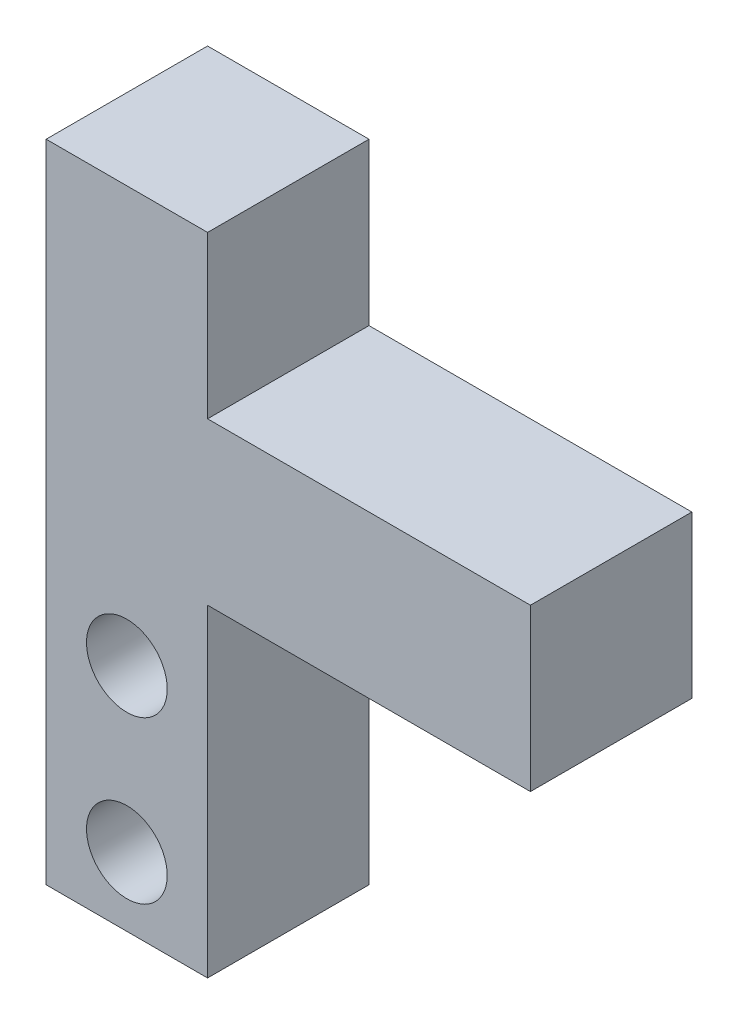
ISO-10303-21;
HEADER;
FILE_DESCRIPTION(('STEP AP214'),'2;1');
FILE_NAME('part.step','',(''),(''),'','','');
FILE_SCHEMA(('AUTOMOTIVE_DESIGN { 1 0 10303 214 1 1 1 1 }'));
ENDSEC;
DATA;
#1=APPLICATION_CONTEXT('core data for automotive mechanical design processes');
#2=APPLICATION_PROTOCOL_DEFINITION('international standard','automotive_design',2000,#1);
#3=PRODUCT_CONTEXT('',#1,'mechanical');
#4=PRODUCT('Part','Part','',(#3));
#5=PRODUCT_RELATED_PRODUCT_CATEGORY('part','',(#4));
#6=PRODUCT_DEFINITION_FORMATION('','',#4);
#7=PRODUCT_DEFINITION_CONTEXT('part definition',#1,'design');
#8=PRODUCT_DEFINITION('design','',#6,#7);
#9=PRODUCT_DEFINITION_SHAPE('','',#8);
#10=(LENGTH_UNIT() NAMED_UNIT(*) SI_UNIT(.MILLI.,.METRE.));
#11=(NAMED_UNIT(*) PLANE_ANGLE_UNIT() SI_UNIT($,.RADIAN.));
#12=(NAMED_UNIT(*) SI_UNIT($,.STERADIAN.) SOLID_ANGLE_UNIT());
#13=UNCERTAINTY_MEASURE_WITH_UNIT(LENGTH_MEASURE(1.E-05),#10,'distance_accuracy_value','');
#14=(GEOMETRIC_REPRESENTATION_CONTEXT(3) GLOBAL_UNCERTAINTY_ASSIGNED_CONTEXT((#13)) GLOBAL_UNIT_ASSIGNED_CONTEXT((#10,
#11,#12)) REPRESENTATION_CONTEXT('',''));
#15=CARTESIAN_POINT('',(0.,0.,0.));
#16=DIRECTION('',(0.,0.,1.));
#17=DIRECTION('',(1.,0.,0.));
#18=AXIS2_PLACEMENT_3D('',#15,#16,#17);
#19=CARTESIAN_POINT('',(0.,0.,10.));
#20=DIRECTION('',(0.,0.,1.));
#21=DIRECTION('',(1.,0.,0.));
#22=AXIS2_PLACEMENT_3D('',#19,#20,#21);
#23=PLANE('',#22);
#24=CARTESIAN_POINT('',(0.,-5.74916487536004,10.));
#25=DIRECTION('',(0.,0.,1.));
#26=DIRECTION('',(1.,0.,0.));
#27=AXIS2_PLACEMENT_3D('',#24,#25,#26);
#28=CIRCLE('',#27,2.5);
#29=CARTESIAN_POINT('',(2.5,-5.74916487536004,10.));
#30=VERTEX_POINT('',#29);
#31=EDGE_CURVE('E133',#30,#30,#28,.T.);
#32=ORIENTED_EDGE('',*,*,#31,.F.);
#33=EDGE_LOOP('',(#32));
#34=FACE_BOUND('',#33,.T.);
#35=DIRECTION('',(-1.,0.,0.));
#36=VECTOR('',#35,1.);
#37=CARTESIAN_POINT('',(-5.,20.,10.));
#38=LINE('',#37,#36);
#39=CARTESIAN_POINT('',(5.,20.,10.));
#40=VERTEX_POINT('',#39);
#41=CARTESIAN_POINT('',(-5.,20.,10.));
#42=VERTEX_POINT('',#41);
#43=EDGE_CURVE('E144',#40,#42,#38,.T.);
#44=ORIENTED_EDGE('',*,*,#43,.T.);
#45=DIRECTION('',(0.,-1.,0.));
#46=VECTOR('',#45,1.);
#47=CARTESIAN_POINT('',(-5.,-20.,10.));
#48=LINE('',#47,#46);
#49=CARTESIAN_POINT('',(-5.,-20.,10.));
#50=VERTEX_POINT('',#49);
#51=EDGE_CURVE('E92',#42,#50,#48,.T.);
#52=ORIENTED_EDGE('',*,*,#51,.T.);
#53=DIRECTION('',(1.,0.,0.));
#54=VECTOR('',#53,1.);
#55=CARTESIAN_POINT('',(-5.,-20.,10.));
#56=LINE('',#55,#54);
#57=CARTESIAN_POINT('',(5.,-20.,10.));
#58=VERTEX_POINT('',#57);
#59=EDGE_CURVE('E159',#50,#58,#56,.T.);
#60=ORIENTED_EDGE('',*,*,#59,.T.);
#61=DIRECTION('',(0.,1.,0.));
#62=VECTOR('',#61,1.);
#63=CARTESIAN_POINT('',(5.,-20.,10.));
#64=LINE('',#63,#62);
#65=CARTESIAN_POINT('',(5.,0.,10.));
#66=VERTEX_POINT('',#65);
#67=EDGE_CURVE('E172',#58,#66,#64,.T.);
#68=ORIENTED_EDGE('',*,*,#67,.T.);
#69=DIRECTION('',(1.,0.,0.));
#70=VECTOR('',#69,1.);
#71=CARTESIAN_POINT('',(5.,0.,10.));
#72=LINE('',#71,#70);
#73=CARTESIAN_POINT('',(25.,0.,10.));
#74=VERTEX_POINT('',#73);
#75=EDGE_CURVE('E111',#66,#74,#72,.T.);
#76=ORIENTED_EDGE('',*,*,#75,.T.);
#77=DIRECTION('',(0.,1.,0.));
#78=VECTOR('',#77,1.);
#79=CARTESIAN_POINT('',(25.,0.,10.));
#80=LINE('',#79,#78);
#81=CARTESIAN_POINT('',(25.,10.,10.));
#82=VERTEX_POINT('',#81);
#83=EDGE_CURVE('E105',#74,#82,#80,.T.);
#84=ORIENTED_EDGE('',*,*,#83,.T.);
#85=DIRECTION('',(-1.,0.,0.));
#86=VECTOR('',#85,1.);
#87=CARTESIAN_POINT('',(5.,10.,10.));
#88=LINE('',#87,#86);
#89=CARTESIAN_POINT('',(5.,10.,10.));
#90=VERTEX_POINT('',#89);
#91=EDGE_CURVE('E109',#82,#90,#88,.T.);
#92=ORIENTED_EDGE('',*,*,#91,.T.);
#93=DIRECTION('',(0.,1.,0.));
#94=VECTOR('',#93,1.);
#95=CARTESIAN_POINT('',(5.,10.,10.));
#96=LINE('',#95,#94);
#97=EDGE_CURVE('E49',#90,#40,#96,.T.);
#98=ORIENTED_EDGE('',*,*,#97,.T.);
#99=EDGE_LOOP('',(#44,#52,#60,#68,#76,#84,#92,#98));
#100=FACE_BOUND('',#99,.T.);
#101=CARTESIAN_POINT('',(0.,-15.74916487536,10.));
#102=DIRECTION('',(0.,0.,1.));
#103=DIRECTION('',(1.,0.,0.));
#104=AXIS2_PLACEMENT_3D('',#101,#102,#103);
#105=CIRCLE('',#104,2.5);
#106=CARTESIAN_POINT('',(2.5,-15.74916487536,10.));
#107=VERTEX_POINT('',#106);
#108=EDGE_CURVE('E181',#107,#107,#105,.T.);
#109=ORIENTED_EDGE('',*,*,#108,.F.);
#110=EDGE_LOOP('',(#109));
#111=FACE_BOUND('',#110,.T.);
#112=ADVANCED_FACE('F32',(#34,#100,#111),#23,.T.);
#113=CARTESIAN_POINT('',(0.,0.,0.));
#114=DIRECTION('',(0.,0.,1.));
#115=DIRECTION('',(1.,0.,0.));
#116=AXIS2_PLACEMENT_3D('',#113,#114,#115);
#117=PLANE('',#116);
#118=DIRECTION('',(-1.,0.,0.));
#119=VECTOR('',#118,1.);
#120=CARTESIAN_POINT('',(-5.,20.,0.));
#121=LINE('',#120,#119);
#122=CARTESIAN_POINT('',(5.,20.,0.));
#123=VERTEX_POINT('',#122);
#124=CARTESIAN_POINT('',(-5.,20.,0.));
#125=VERTEX_POINT('',#124);
#126=EDGE_CURVE('E129',#123,#125,#121,.T.);
#127=ORIENTED_EDGE('',*,*,#126,.F.);
#128=DIRECTION('',(0.,1.,0.));
#129=VECTOR('',#128,1.);
#130=CARTESIAN_POINT('',(5.,10.,0.));
#131=LINE('',#130,#129);
#132=CARTESIAN_POINT('',(5.,10.,0.));
#133=VERTEX_POINT('',#132);
#134=EDGE_CURVE('E84',#133,#123,#131,.T.);
#135=ORIENTED_EDGE('',*,*,#134,.F.);
#136=DIRECTION('',(-1.,0.,0.));
#137=VECTOR('',#136,1.);
#138=CARTESIAN_POINT('',(5.,10.,0.));
#139=LINE('',#138,#137);
#140=CARTESIAN_POINT('',(25.,10.,0.));
#141=VERTEX_POINT('',#140);
#142=EDGE_CURVE('E78',#141,#133,#139,.T.);
#143=ORIENTED_EDGE('',*,*,#142,.F.);
#144=DIRECTION('',(0.,1.,0.));
#145=VECTOR('',#144,1.);
#146=CARTESIAN_POINT('',(25.,0.,0.));
#147=LINE('',#146,#145);
#148=CARTESIAN_POINT('',(25.,0.,0.));
#149=VERTEX_POINT('',#148);
#150=EDGE_CURVE('E119',#149,#141,#147,.T.);
#151=ORIENTED_EDGE('',*,*,#150,.F.);
#152=DIRECTION('',(1.,0.,0.));
#153=VECTOR('',#152,1.);
#154=CARTESIAN_POINT('',(5.,0.,0.));
#155=LINE('',#154,#153);
#156=CARTESIAN_POINT('',(5.,0.,0.));
#157=VERTEX_POINT('',#156);
#158=EDGE_CURVE('E139',#157,#149,#155,.T.);
#159=ORIENTED_EDGE('',*,*,#158,.F.);
#160=DIRECTION('',(0.,1.,0.));
#161=VECTOR('',#160,1.);
#162=CARTESIAN_POINT('',(5.,-20.,0.));
#163=LINE('',#162,#161);
#164=CARTESIAN_POINT('',(5.,-20.,0.));
#165=VERTEX_POINT('',#164);
#166=EDGE_CURVE('E137',#165,#157,#163,.T.);
#167=ORIENTED_EDGE('',*,*,#166,.F.);
#168=DIRECTION('',(1.,0.,0.));
#169=VECTOR('',#168,1.);
#170=CARTESIAN_POINT('',(-5.,-20.,0.));
#171=LINE('',#170,#169);
#172=CARTESIAN_POINT('',(-5.,-20.,0.));
#173=VERTEX_POINT('',#172);
#174=EDGE_CURVE('E135',#173,#165,#171,.T.);
#175=ORIENTED_EDGE('',*,*,#174,.F.);
#176=DIRECTION('',(0.,-1.,0.));
#177=VECTOR('',#176,1.);
#178=CARTESIAN_POINT('',(-5.,-20.,0.));
#179=LINE('',#178,#177);
#180=EDGE_CURVE('E132',#125,#173,#179,.T.);
#181=ORIENTED_EDGE('',*,*,#180,.F.);
#182=EDGE_LOOP('',(#127,#135,#143,#151,#159,#167,#175,#181));
#183=FACE_BOUND('',#182,.T.);
#184=CARTESIAN_POINT('',(0.,-5.74916487536004,0.));
#185=DIRECTION('',(0.,0.,1.));
#186=DIRECTION('',(1.,0.,0.));
#187=AXIS2_PLACEMENT_3D('',#184,#185,#186);
#188=CIRCLE('',#187,2.5);
#189=CARTESIAN_POINT('',(2.5,-5.74916487536004,0.));
#190=VERTEX_POINT('',#189);
#191=EDGE_CURVE('E178',#190,#190,#188,.T.);
#192=ORIENTED_EDGE('',*,*,#191,.T.);
#193=EDGE_LOOP('',(#192));
#194=FACE_BOUND('',#193,.T.);
#195=CARTESIAN_POINT('',(0.,-15.74916487536,0.));
#196=DIRECTION('',(0.,0.,1.));
#197=DIRECTION('',(1.,0.,0.));
#198=AXIS2_PLACEMENT_3D('',#195,#196,#197);
#199=CIRCLE('',#198,2.5);
#200=CARTESIAN_POINT('',(2.5,-15.74916487536,0.));
#201=VERTEX_POINT('',#200);
#202=EDGE_CURVE('E184',#201,#201,#199,.T.);
#203=ORIENTED_EDGE('',*,*,#202,.T.);
#204=EDGE_LOOP('',(#203));
#205=FACE_BOUND('',#204,.T.);
#206=ADVANCED_FACE('F163',(#183,#194,#205),#117,.F.);
#207=CARTESIAN_POINT('',(-5.,20.,10.));
#208=DIRECTION('',(0.,-1.,0.));
#209=DIRECTION('',(0.,0.,-1.));
#210=AXIS2_PLACEMENT_3D('',#207,#208,#209);
#211=PLANE('',#210);
#212=ORIENTED_EDGE('',*,*,#126,.T.);
#213=DIRECTION('',(0.,0.,-1.));
#214=VECTOR('',#213,1.);
#215=CARTESIAN_POINT('',(-5.,20.,10.));
#216=LINE('',#215,#214);
#217=EDGE_CURVE('E11',#42,#125,#216,.T.);
#218=ORIENTED_EDGE('',*,*,#217,.F.);
#219=ORIENTED_EDGE('',*,*,#43,.F.);
#220=DIRECTION('',(0.,0.,-1.));
#221=VECTOR('',#220,1.);
#222=CARTESIAN_POINT('',(5.,20.,10.));
#223=LINE('',#222,#221);
#224=EDGE_CURVE('E125',#40,#123,#223,.T.);
#225=ORIENTED_EDGE('',*,*,#224,.T.);
#226=EDGE_LOOP('',(#212,#218,#219,#225));
#227=FACE_BOUND('',#226,.T.);
#228=ADVANCED_FACE('F34',(#227),#211,.F.);
#229=CARTESIAN_POINT('',(-5.,-20.,10.));
#230=DIRECTION('',(1.,0.,0.));
#231=DIRECTION('',(0.,0.,-1.));
#232=AXIS2_PLACEMENT_3D('',#229,#230,#231);
#233=PLANE('',#232);
#234=ORIENTED_EDGE('',*,*,#180,.T.);
#235=DIRECTION('',(0.,0.,-1.));
#236=VECTOR('',#235,1.);
#237=CARTESIAN_POINT('',(-5.,-20.,10.));
#238=LINE('',#237,#236);
#239=EDGE_CURVE('E41',#50,#173,#238,.T.);
#240=ORIENTED_EDGE('',*,*,#239,.F.);
#241=ORIENTED_EDGE('',*,*,#51,.F.);
#242=ORIENTED_EDGE('',*,*,#217,.T.);
#243=EDGE_LOOP('',(#234,#240,#241,#242));
#244=FACE_BOUND('',#243,.T.);
#245=ADVANCED_FACE('F216',(#244),#233,.F.);
#246=CARTESIAN_POINT('',(-5.,-20.,10.));
#247=DIRECTION('',(0.,1.,0.));
#248=DIRECTION('',(0.,0.,1.));
#249=AXIS2_PLACEMENT_3D('',#246,#247,#248);
#250=PLANE('',#249);
#251=ORIENTED_EDGE('',*,*,#174,.T.);
#252=DIRECTION('',(0.,0.,-1.));
#253=VECTOR('',#252,1.);
#254=CARTESIAN_POINT('',(5.,-20.,10.));
#255=LINE('',#254,#253);
#256=EDGE_CURVE('E151',#58,#165,#255,.T.);
#257=ORIENTED_EDGE('',*,*,#256,.F.);
#258=ORIENTED_EDGE('',*,*,#59,.F.);
#259=ORIENTED_EDGE('',*,*,#239,.T.);
#260=EDGE_LOOP('',(#251,#257,#258,#259));
#261=FACE_BOUND('',#260,.T.);
#262=ADVANCED_FACE('F157',(#261),#250,.F.);
#263=CARTESIAN_POINT('',(5.,-20.,10.));
#264=DIRECTION('',(-1.,0.,0.));
#265=DIRECTION('',(0.,0.,1.));
#266=AXIS2_PLACEMENT_3D('',#263,#264,#265);
#267=PLANE('',#266);
#268=ORIENTED_EDGE('',*,*,#166,.T.);
#269=DIRECTION('',(0.,0.,-1.));
#270=VECTOR('',#269,1.);
#271=CARTESIAN_POINT('',(5.,0.,10.));
#272=LINE('',#271,#270);
#273=EDGE_CURVE('E148',#66,#157,#272,.T.);
#274=ORIENTED_EDGE('',*,*,#273,.F.);
#275=ORIENTED_EDGE('',*,*,#67,.F.);
#276=ORIENTED_EDGE('',*,*,#256,.T.);
#277=EDGE_LOOP('',(#268,#274,#275,#276));
#278=FACE_BOUND('',#277,.T.);
#279=ADVANCED_FACE('F168',(#278),#267,.F.);
#280=CARTESIAN_POINT('',(5.,0.,10.));
#281=DIRECTION('',(0.,1.,0.));
#282=DIRECTION('',(-1.,0.,0.));
#283=AXIS2_PLACEMENT_3D('',#280,#281,#282);
#284=PLANE('',#283);
#285=ORIENTED_EDGE('',*,*,#158,.T.);
#286=DIRECTION('',(0.,0.,-1.));
#287=VECTOR('',#286,1.);
#288=CARTESIAN_POINT('',(25.,0.,10.));
#289=LINE('',#288,#287);
#290=EDGE_CURVE('E120',#74,#149,#289,.T.);
#291=ORIENTED_EDGE('',*,*,#290,.F.);
#292=ORIENTED_EDGE('',*,*,#75,.F.);
#293=ORIENTED_EDGE('',*,*,#273,.T.);
#294=EDGE_LOOP('',(#285,#291,#292,#293));
#295=FACE_BOUND('',#294,.T.);
#296=ADVANCED_FACE('F171',(#295),#284,.F.);
#297=CARTESIAN_POINT('',(25.,0.,10.));
#298=DIRECTION('',(-1.,0.,0.));
#299=DIRECTION('',(0.,0.,1.));
#300=AXIS2_PLACEMENT_3D('',#297,#298,#299);
#301=PLANE('',#300);
#302=ORIENTED_EDGE('',*,*,#150,.T.);
#303=DIRECTION('',(0.,0.,-1.));
#304=VECTOR('',#303,1.);
#305=CARTESIAN_POINT('',(25.,10.,10.));
#306=LINE('',#305,#304);
#307=EDGE_CURVE('E116',#82,#141,#306,.T.);
#308=ORIENTED_EDGE('',*,*,#307,.F.);
#309=ORIENTED_EDGE('',*,*,#83,.F.);
#310=ORIENTED_EDGE('',*,*,#290,.T.);
#311=EDGE_LOOP('',(#302,#308,#309,#310));
#312=FACE_BOUND('',#311,.T.);
#313=ADVANCED_FACE('F117',(#312),#301,.F.);
#314=CARTESIAN_POINT('',(5.,10.,10.));
#315=DIRECTION('',(0.,-1.,0.));
#316=DIRECTION('',(0.,0.,-1.));
#317=AXIS2_PLACEMENT_3D('',#314,#315,#316);
#318=PLANE('',#317);
#319=ORIENTED_EDGE('',*,*,#142,.T.);
#320=DIRECTION('',(0.,0.,-1.));
#321=VECTOR('',#320,1.);
#322=CARTESIAN_POINT('',(5.,10.,10.));
#323=LINE('',#322,#321);
#324=EDGE_CURVE('E121',#90,#133,#323,.T.);
#325=ORIENTED_EDGE('',*,*,#324,.F.);
#326=ORIENTED_EDGE('',*,*,#91,.F.);
#327=ORIENTED_EDGE('',*,*,#307,.T.);
#328=EDGE_LOOP('',(#319,#325,#326,#327));
#329=FACE_BOUND('',#328,.T.);
#330=ADVANCED_FACE('F123',(#329),#318,.F.);
#331=CARTESIAN_POINT('',(5.,10.,10.));
#332=DIRECTION('',(-1.,0.,0.));
#333=DIRECTION('',(0.,0.,1.));
#334=AXIS2_PLACEMENT_3D('',#331,#332,#333);
#335=PLANE('',#334);
#336=ORIENTED_EDGE('',*,*,#134,.T.);
#337=ORIENTED_EDGE('',*,*,#224,.F.);
#338=ORIENTED_EDGE('',*,*,#97,.F.);
#339=ORIENTED_EDGE('',*,*,#324,.T.);
#340=EDGE_LOOP('',(#336,#337,#338,#339));
#341=FACE_BOUND('',#340,.T.);
#342=ADVANCED_FACE('F204',(#341),#335,.F.);
#343=CARTESIAN_POINT('',(0.,-5.74916487536004,10.));
#344=DIRECTION('',(0.,0.,-1.));
#345=DIRECTION('',(-1.,0.,0.));
#346=AXIS2_PLACEMENT_3D('',#343,#344,#345);
#347=CYLINDRICAL_SURFACE('',#346,2.5);
#348=ORIENTED_EDGE('',*,*,#31,.T.);
#349=EDGE_LOOP('',(#348));
#350=FACE_BOUND('',#349,.T.);
#351=ORIENTED_EDGE('',*,*,#191,.F.);
#352=EDGE_LOOP('',(#351));
#353=FACE_BOUND('',#352,.T.);
#354=ADVANCED_FACE('F201',(#350,#353),#347,.F.);
#355=CARTESIAN_POINT('',(0.,-15.74916487536,10.));
#356=DIRECTION('',(0.,0.,-1.));
#357=DIRECTION('',(-1.,0.,0.));
#358=AXIS2_PLACEMENT_3D('',#355,#356,#357);
#359=CYLINDRICAL_SURFACE('',#358,2.5);
#360=ORIENTED_EDGE('',*,*,#108,.T.);
#361=EDGE_LOOP('',(#360));
#362=FACE_BOUND('',#361,.T.);
#363=ORIENTED_EDGE('',*,*,#202,.F.);
#364=EDGE_LOOP('',(#363));
#365=FACE_BOUND('',#364,.T.);
#366=ADVANCED_FACE('F190',(#362,#365),#359,.F.);
#367=CLOSED_SHELL('',(#112,#206,#228,#245,#262,#279,#296,#313,#330,#342,#354,#366));
#368=MANIFOLD_SOLID_BREP('B2',#367);
#369=ADVANCED_BREP_SHAPE_REPRESENTATION('',(#18,#368),#14);
#370=SHAPE_DEFINITION_REPRESENTATION(#9,#369);
ENDSEC;
END-ISO-10303-21;
